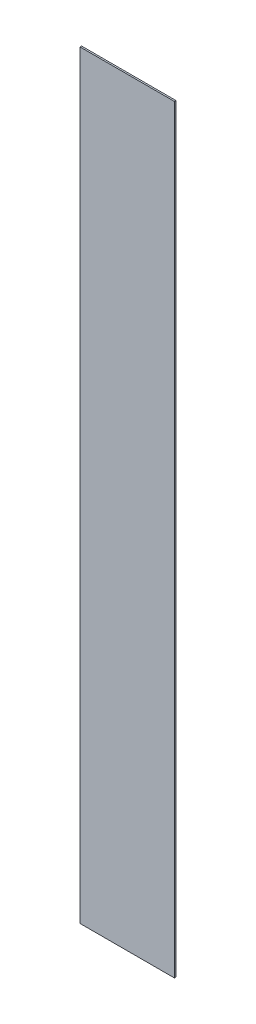
ISO-10303-21;
HEADER;
FILE_DESCRIPTION(('STEP AP214'),'2;1');
FILE_NAME('part.step','',(''),(''),'','','');
FILE_SCHEMA(('AUTOMOTIVE_DESIGN { 1 0 10303 214 1 1 1 1 }'));
ENDSEC;
DATA;
#1=APPLICATION_CONTEXT('core data for automotive mechanical design processes');
#2=APPLICATION_PROTOCOL_DEFINITION('international standard','automotive_design',2000,#1);
#3=PRODUCT_CONTEXT('',#1,'mechanical');
#4=PRODUCT('Part','Part','',(#3));
#5=PRODUCT_RELATED_PRODUCT_CATEGORY('part','',(#4));
#6=PRODUCT_DEFINITION_FORMATION('','',#4);
#7=PRODUCT_DEFINITION_CONTEXT('part definition',#1,'design');
#8=PRODUCT_DEFINITION('design','',#6,#7);
#9=PRODUCT_DEFINITION_SHAPE('','',#8);
#10=(LENGTH_UNIT() NAMED_UNIT(*) SI_UNIT(.MILLI.,.METRE.));
#11=(NAMED_UNIT(*) PLANE_ANGLE_UNIT() SI_UNIT($,.RADIAN.));
#12=(NAMED_UNIT(*) SI_UNIT($,.STERADIAN.) SOLID_ANGLE_UNIT());
#13=UNCERTAINTY_MEASURE_WITH_UNIT(LENGTH_MEASURE(1.E-05),#10,'distance_accuracy_value','');
#14=(GEOMETRIC_REPRESENTATION_CONTEXT(3) GLOBAL_UNCERTAINTY_ASSIGNED_CONTEXT((#13)) GLOBAL_UNIT_ASSIGNED_CONTEXT((#10,
#11,#12)) REPRESENTATION_CONTEXT('',''));
#15=CARTESIAN_POINT('',(0.,0.,0.));
#16=DIRECTION('',(0.,0.,1.));
#17=DIRECTION('',(1.,0.,0.));
#18=AXIS2_PLACEMENT_3D('',#15,#16,#17);
#19=CARTESIAN_POINT('',(-300.,-2411.5,10.));
#20=DIRECTION('',(1.,0.,0.));
#21=DIRECTION('',(0.,0.,-1.));
#22=AXIS2_PLACEMENT_3D('',#19,#20,#21);
#23=PLANE('',#22);
#24=DIRECTION('',(0.,-1.,0.));
#25=VECTOR('',#24,1.);
#26=CARTESIAN_POINT('',(-300.,-2411.5,0.));
#27=LINE('',#26,#25);
#28=CARTESIAN_POINT('',(-300.,2411.5,0.));
#29=VERTEX_POINT('',#28);
#30=CARTESIAN_POINT('',(-300.,-2411.5,0.));
#31=VERTEX_POINT('',#30);
#32=EDGE_CURVE('E96',#29,#31,#27,.T.);
#33=ORIENTED_EDGE('',*,*,#32,.T.);
#34=DIRECTION('',(0.,0.,-1.));
#35=VECTOR('',#34,1.);
#36=CARTESIAN_POINT('',(-300.,-2411.5,10.));
#37=LINE('',#36,#35);
#38=CARTESIAN_POINT('',(-300.,-2411.5,10.));
#39=VERTEX_POINT('',#38);
#40=EDGE_CURVE('E11',#39,#31,#37,.T.);
#41=ORIENTED_EDGE('',*,*,#40,.F.);
#42=DIRECTION('',(0.,-1.,0.));
#43=VECTOR('',#42,1.);
#44=CARTESIAN_POINT('',(-300.,-2411.5,10.));
#45=LINE('',#44,#43);
#46=CARTESIAN_POINT('',(-300.,2411.5,10.));
#47=VERTEX_POINT('',#46);
#48=EDGE_CURVE('E84',#47,#39,#45,.T.);
#49=ORIENTED_EDGE('',*,*,#48,.F.);
#50=DIRECTION('',(0.,0.,-1.));
#51=VECTOR('',#50,1.);
#52=CARTESIAN_POINT('',(-300.,2411.5,10.));
#53=LINE('',#52,#51);
#54=EDGE_CURVE('E92',#47,#29,#53,.T.);
#55=ORIENTED_EDGE('',*,*,#54,.T.);
#56=EDGE_LOOP('',(#33,#41,#49,#55));
#57=FACE_BOUND('',#56,.T.);
#58=ADVANCED_FACE('F33',(#57),#23,.F.);
#59=CARTESIAN_POINT('',(300.,-2411.5,10.));
#60=DIRECTION('',(0.,1.,0.));
#61=DIRECTION('',(0.,0.,1.));
#62=AXIS2_PLACEMENT_3D('',#59,#60,#61);
#63=PLANE('',#62);
#64=DIRECTION('',(1.,0.,0.));
#65=VECTOR('',#64,1.);
#66=CARTESIAN_POINT('',(300.,-2411.5,0.));
#67=LINE('',#66,#65);
#68=CARTESIAN_POINT('',(300.,-2411.5,0.));
#69=VERTEX_POINT('',#68);
#70=EDGE_CURVE('E88',#31,#69,#67,.T.);
#71=ORIENTED_EDGE('',*,*,#70,.T.);
#72=DIRECTION('',(0.,0.,-1.));
#73=VECTOR('',#72,1.);
#74=CARTESIAN_POINT('',(300.,-2411.5,10.));
#75=LINE('',#74,#73);
#76=CARTESIAN_POINT('',(300.,-2411.5,10.));
#77=VERTEX_POINT('',#76);
#78=EDGE_CURVE('E41',#77,#69,#75,.T.);
#79=ORIENTED_EDGE('',*,*,#78,.F.);
#80=DIRECTION('',(1.,0.,0.));
#81=VECTOR('',#80,1.);
#82=CARTESIAN_POINT('',(300.,-2411.5,10.));
#83=LINE('',#82,#81);
#84=EDGE_CURVE('E79',#39,#77,#83,.T.);
#85=ORIENTED_EDGE('',*,*,#84,.F.);
#86=ORIENTED_EDGE('',*,*,#40,.T.);
#87=EDGE_LOOP('',(#71,#79,#85,#86));
#88=FACE_BOUND('',#87,.T.);
#89=ADVANCED_FACE('F87',(#88),#63,.F.);
#90=CARTESIAN_POINT('',(300.,-2411.5,10.));
#91=DIRECTION('',(-1.,0.,0.));
#92=DIRECTION('',(0.,0.,1.));
#93=AXIS2_PLACEMENT_3D('',#90,#91,#92);
#94=PLANE('',#93);
#95=DIRECTION('',(0.,1.,0.));
#96=VECTOR('',#95,1.);
#97=CARTESIAN_POINT('',(300.,-2411.5,0.));
#98=LINE('',#97,#96);
#99=CARTESIAN_POINT('',(300.,2411.5,0.));
#100=VERTEX_POINT('',#99);
#101=EDGE_CURVE('E66',#69,#100,#98,.T.);
#102=ORIENTED_EDGE('',*,*,#101,.T.);
#103=DIRECTION('',(0.,0.,-1.));
#104=VECTOR('',#103,1.);
#105=CARTESIAN_POINT('',(300.,2411.5,10.));
#106=LINE('',#105,#104);
#107=CARTESIAN_POINT('',(300.,2411.5,10.));
#108=VERTEX_POINT('',#107);
#109=EDGE_CURVE('E89',#108,#100,#106,.T.);
#110=ORIENTED_EDGE('',*,*,#109,.F.);
#111=DIRECTION('',(0.,1.,0.));
#112=VECTOR('',#111,1.);
#113=CARTESIAN_POINT('',(300.,-2411.5,10.));
#114=LINE('',#113,#112);
#115=EDGE_CURVE('E82',#77,#108,#114,.T.);
#116=ORIENTED_EDGE('',*,*,#115,.F.);
#117=ORIENTED_EDGE('',*,*,#78,.T.);
#118=EDGE_LOOP('',(#102,#110,#116,#117));
#119=FACE_BOUND('',#118,.T.);
#120=ADVANCED_FACE('F90',(#119),#94,.F.);
#121=CARTESIAN_POINT('',(300.,2411.5,10.));
#122=DIRECTION('',(0.,-1.,0.));
#123=DIRECTION('',(0.,0.,-1.));
#124=AXIS2_PLACEMENT_3D('',#121,#122,#123);
#125=PLANE('',#124);
#126=DIRECTION('',(-1.,0.,0.));
#127=VECTOR('',#126,1.);
#128=CARTESIAN_POINT('',(300.,2411.5,0.));
#129=LINE('',#128,#127);
#130=EDGE_CURVE('E72',#100,#29,#129,.T.);
#131=ORIENTED_EDGE('',*,*,#130,.T.);
#132=ORIENTED_EDGE('',*,*,#54,.F.);
#133=DIRECTION('',(-1.,0.,0.));
#134=VECTOR('',#133,1.);
#135=CARTESIAN_POINT('',(300.,2411.5,10.));
#136=LINE('',#135,#134);
#137=EDGE_CURVE('E49',#108,#47,#136,.T.);
#138=ORIENTED_EDGE('',*,*,#137,.F.);
#139=ORIENTED_EDGE('',*,*,#109,.T.);
#140=EDGE_LOOP('',(#131,#132,#138,#139));
#141=FACE_BOUND('',#140,.T.);
#142=ADVANCED_FACE('F103',(#141),#125,.F.);
#143=CARTESIAN_POINT('',(0.,0.,10.));
#144=DIRECTION('',(0.,0.,1.));
#145=DIRECTION('',(1.,0.,0.));
#146=AXIS2_PLACEMENT_3D('',#143,#144,#145);
#147=PLANE('',#146);
#148=ORIENTED_EDGE('',*,*,#48,.T.);
#149=ORIENTED_EDGE('',*,*,#84,.T.);
#150=ORIENTED_EDGE('',*,*,#115,.T.);
#151=ORIENTED_EDGE('',*,*,#137,.T.);
#152=EDGE_LOOP('',(#148,#149,#150,#151));
#153=FACE_BOUND('',#152,.T.);
#154=ADVANCED_FACE('F80',(#153),#147,.T.);
#155=CARTESIAN_POINT('',(0.,0.,0.));
#156=DIRECTION('',(0.,0.,1.));
#157=DIRECTION('',(1.,0.,0.));
#158=AXIS2_PLACEMENT_3D('',#155,#156,#157);
#159=PLANE('',#158);
#160=ORIENTED_EDGE('',*,*,#32,.F.);
#161=ORIENTED_EDGE('',*,*,#130,.F.);
#162=ORIENTED_EDGE('',*,*,#101,.F.);
#163=ORIENTED_EDGE('',*,*,#70,.F.);
#164=EDGE_LOOP('',(#160,#161,#162,#163));
#165=FACE_BOUND('',#164,.T.);
#166=ADVANCED_FACE('F106',(#165),#159,.F.);
#167=CLOSED_SHELL('',(#58,#89,#120,#142,#154,#166));
#168=MANIFOLD_SOLID_BREP('B2',#167);
#169=ADVANCED_BREP_SHAPE_REPRESENTATION('',(#18,#168),#14);
#170=SHAPE_DEFINITION_REPRESENTATION(#9,#169);
ENDSEC;
END-ISO-10303-21;
